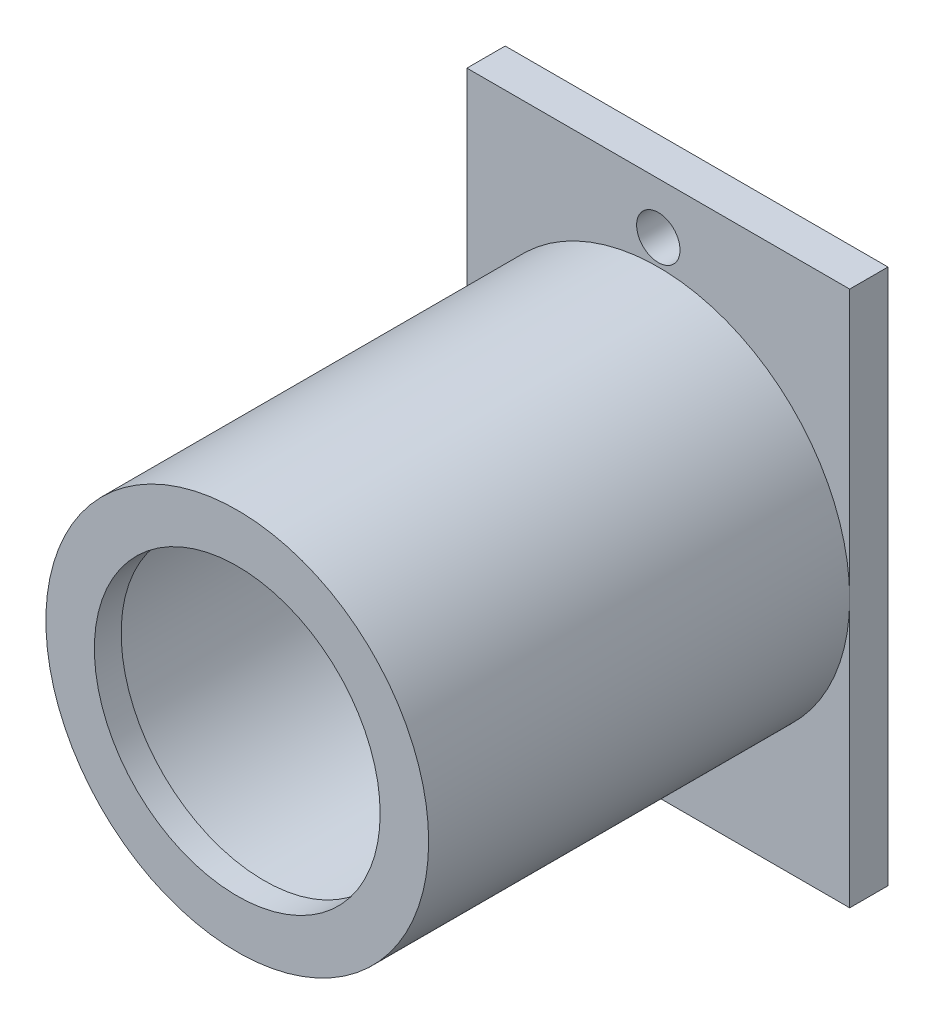
ISO-10303-21;
HEADER;
FILE_DESCRIPTION(('STEP AP214'),'2;1');
FILE_NAME('part.step','',(''),(''),'','','');
FILE_SCHEMA(('AUTOMOTIVE_DESIGN { 1 0 10303 214 1 1 1 1 }'));
ENDSEC;
DATA;
#1=APPLICATION_CONTEXT('core data for automotive mechanical design processes');
#2=APPLICATION_PROTOCOL_DEFINITION('international standard','automotive_design',2000,#1);
#3=PRODUCT_CONTEXT('',#1,'mechanical');
#4=PRODUCT('Part','Part','',(#3));
#5=PRODUCT_RELATED_PRODUCT_CATEGORY('part','',(#4));
#6=PRODUCT_DEFINITION_FORMATION('','',#4);
#7=PRODUCT_DEFINITION_CONTEXT('part definition',#1,'design');
#8=PRODUCT_DEFINITION('design','',#6,#7);
#9=PRODUCT_DEFINITION_SHAPE('','',#8);
#10=(LENGTH_UNIT() NAMED_UNIT(*) SI_UNIT(.MILLI.,.METRE.));
#11=(NAMED_UNIT(*) PLANE_ANGLE_UNIT() SI_UNIT($,.RADIAN.));
#12=(NAMED_UNIT(*) SI_UNIT($,.STERADIAN.) SOLID_ANGLE_UNIT());
#13=UNCERTAINTY_MEASURE_WITH_UNIT(LENGTH_MEASURE(1.E-05),#10,'distance_accuracy_value','');
#14=(GEOMETRIC_REPRESENTATION_CONTEXT(3) GLOBAL_UNCERTAINTY_ASSIGNED_CONTEXT((#13)) GLOBAL_UNIT_ASSIGNED_CONTEXT((#10,
#11,#12)) REPRESENTATION_CONTEXT('',''));
#15=CARTESIAN_POINT('',(0.,0.,0.));
#16=DIRECTION('',(0.,0.,1.));
#17=DIRECTION('',(1.,0.,0.));
#18=AXIS2_PLACEMENT_3D('',#15,#16,#17);
#19=CARTESIAN_POINT('',(-183.,76.,245.4));
#20=DIRECTION('',(0.,0.,1.));
#21=DIRECTION('',(1.,0.,0.));
#22=AXIS2_PLACEMENT_3D('',#19,#20,#21);
#23=CYLINDRICAL_SURFACE('',#22,13.);
#24=DIRECTION('',(0.,0.,1.));
#25=VECTOR('',#24,1.);
#26=CARTESIAN_POINT('',(-170.,76.,245.5));
#27=LINE('',#26,#25);
#28=CARTESIAN_POINT('',(-170.,76.,245.5));
#29=VERTEX_POINT('',#28);
#30=CARTESIAN_POINT('',(-170.,76.,279.4));
#31=VERTEX_POINT('',#30);
#32=EDGE_CURVE('E9',#29,#31,#27,.T.);
#33=ORIENTED_EDGE('',*,*,#32,.F.);
#34=CARTESIAN_POINT('',(-183.,76.,245.5));
#35=DIRECTION('',(0.,0.,1.));
#36=DIRECTION('',(1.,0.,0.));
#37=AXIS2_PLACEMENT_3D('',#34,#35,#36);
#38=CIRCLE('',#37,13.);
#39=EDGE_CURVE('E72',#29,#29,#38,.T.);
#40=ORIENTED_EDGE('',*,*,#39,.F.);
#41=ORIENTED_EDGE('',*,*,#32,.T.);
#42=CARTESIAN_POINT('',(-183.,76.,279.4));
#43=DIRECTION('',(0.,0.,1.));
#44=DIRECTION('',(1.,0.,0.));
#45=AXIS2_PLACEMENT_3D('',#42,#43,#44);
#46=CIRCLE('',#45,13.);
#47=EDGE_CURVE('E25',#31,#31,#46,.T.);
#48=ORIENTED_EDGE('',*,*,#47,.T.);
#49=EDGE_LOOP('',(#33,#40,#41,#48));
#50=FACE_BOUND('',#49,.T.);
#51=ADVANCED_FACE('F14',(#50),#23,.F.);
#52=CARTESIAN_POINT('',(-183.,76.,279.4));
#53=DIRECTION('',(0.,0.,1.));
#54=DIRECTION('',(1.,0.,0.));
#55=AXIS2_PLACEMENT_3D('',#52,#53,#54);
#56=PLANE('',#55);
#57=CARTESIAN_POINT('',(-183.,76.,279.4));
#58=DIRECTION('',(0.,0.,1.));
#59=DIRECTION('',(1.,0.,0.));
#60=AXIS2_PLACEMENT_3D('',#57,#58,#59);
#61=CIRCLE('',#60,11.2);
#62=CARTESIAN_POINT('',(-171.8,76.,279.4));
#63=VERTEX_POINT('',#62);
#64=EDGE_CURVE('E64',#63,#63,#61,.T.);
#65=ORIENTED_EDGE('',*,*,#64,.T.);
#66=EDGE_LOOP('',(#65));
#67=FACE_BOUND('',#66,.T.);
#68=ORIENTED_EDGE('',*,*,#47,.F.);
#69=EDGE_LOOP('',(#68));
#70=FACE_BOUND('',#69,.T.);
#71=ADVANCED_FACE('F16',(#67,#70),#56,.F.);
#72=CARTESIAN_POINT('',(-198.,55.,245.5));
#73=DIRECTION('',(0.,0.,1.));
#74=DIRECTION('',(1.,0.,0.));
#75=AXIS2_PLACEMENT_3D('',#72,#73,#74);
#76=PLANE('',#75);
#77=CARTESIAN_POINT('',(-183.,93.,245.5));
#78=DIRECTION('',(0.,0.,1.));
#79=DIRECTION('',(1.,0.,0.));
#80=AXIS2_PLACEMENT_3D('',#77,#78,#79);
#81=CIRCLE('',#80,1.7);
#82=CARTESIAN_POINT('',(-181.3,93.,245.5));
#83=VERTEX_POINT('',#82);
#84=EDGE_CURVE('E66',#83,#83,#81,.T.);
#85=ORIENTED_EDGE('',*,*,#84,.T.);
#86=EDGE_LOOP('',(#85));
#87=FACE_BOUND('',#86,.T.);
#88=ORIENTED_EDGE('',*,*,#39,.T.);
#89=EDGE_LOOP('',(#88));
#90=FACE_BOUND('',#89,.T.);
#91=CARTESIAN_POINT('',(-183.,59.,245.5));
#92=DIRECTION('',(0.,0.,1.));
#93=DIRECTION('',(1.,0.,0.));
#94=AXIS2_PLACEMENT_3D('',#91,#92,#93);
#95=CIRCLE('',#94,1.7);
#96=CARTESIAN_POINT('',(-181.3,59.,245.5));
#97=VERTEX_POINT('',#96);
#98=EDGE_CURVE('E120',#97,#97,#95,.T.);
#99=ORIENTED_EDGE('',*,*,#98,.T.);
#100=EDGE_LOOP('',(#99));
#101=FACE_BOUND('',#100,.T.);
#102=DIRECTION('',(0.,-1.,0.));
#103=VECTOR('',#102,1.);
#104=CARTESIAN_POINT('',(-198.,97.,245.5));
#105=LINE('',#104,#103);
#106=CARTESIAN_POINT('',(-198.,97.,245.5));
#107=VERTEX_POINT('',#106);
#108=CARTESIAN_POINT('',(-198.,55.,245.5));
#109=VERTEX_POINT('',#108);
#110=EDGE_CURVE('E106',#107,#109,#105,.T.);
#111=ORIENTED_EDGE('',*,*,#110,.F.);
#112=DIRECTION('',(1.,0.,0.));
#113=VECTOR('',#112,1.);
#114=CARTESIAN_POINT('',(-198.,97.,245.5));
#115=LINE('',#114,#113);
#116=CARTESIAN_POINT('',(-168.,97.,245.5));
#117=VERTEX_POINT('',#116);
#118=EDGE_CURVE('E116',#107,#117,#115,.T.);
#119=ORIENTED_EDGE('',*,*,#118,.T.);
#120=DIRECTION('',(0.,1.,0.));
#121=VECTOR('',#120,1.);
#122=CARTESIAN_POINT('',(-168.,55.,245.5));
#123=LINE('',#122,#121);
#124=CARTESIAN_POINT('',(-168.,55.,245.5));
#125=VERTEX_POINT('',#124);
#126=EDGE_CURVE('E111',#125,#117,#123,.T.);
#127=ORIENTED_EDGE('',*,*,#126,.F.);
#128=DIRECTION('',(1.,0.,0.));
#129=VECTOR('',#128,1.);
#130=CARTESIAN_POINT('',(-198.,55.,245.5));
#131=LINE('',#130,#129);
#132=EDGE_CURVE('E110',#109,#125,#131,.T.);
#133=ORIENTED_EDGE('',*,*,#132,.F.);
#134=EDGE_LOOP('',(#111,#119,#127,#133));
#135=FACE_BOUND('',#134,.T.);
#136=ADVANCED_FACE('F191',(#87,#90,#101,#135),#76,.F.);
#137=CARTESIAN_POINT('',(-183.,76.,279.4));
#138=DIRECTION('',(0.,0.,1.));
#139=DIRECTION('',(1.,0.,0.));
#140=AXIS2_PLACEMENT_3D('',#137,#138,#139);
#141=CYLINDRICAL_SURFACE('',#140,11.2);
#142=DIRECTION('',(0.,0.,1.));
#143=VECTOR('',#142,1.);
#144=CARTESIAN_POINT('',(-171.8,76.,279.4));
#145=LINE('',#144,#143);
#146=CARTESIAN_POINT('',(-171.8,76.,281.5));
#147=VERTEX_POINT('',#146);
#148=EDGE_CURVE('E60',#63,#147,#145,.T.);
#149=ORIENTED_EDGE('',*,*,#148,.F.);
#150=ORIENTED_EDGE('',*,*,#64,.F.);
#151=ORIENTED_EDGE('',*,*,#148,.T.);
#152=CARTESIAN_POINT('',(-183.,76.,281.5));
#153=DIRECTION('',(0.,0.,1.));
#154=DIRECTION('',(1.,0.,0.));
#155=AXIS2_PLACEMENT_3D('',#152,#153,#154);
#156=CIRCLE('',#155,11.2);
#157=EDGE_CURVE('E18',#147,#147,#156,.T.);
#158=ORIENTED_EDGE('',*,*,#157,.T.);
#159=EDGE_LOOP('',(#149,#150,#151,#158));
#160=FACE_BOUND('',#159,.T.);
#161=ADVANCED_FACE('F61',(#160),#141,.F.);
#162=CARTESIAN_POINT('',(-183.,93.,245.4));
#163=DIRECTION('',(0.,0.,1.));
#164=DIRECTION('',(1.,0.,0.));
#165=AXIS2_PLACEMENT_3D('',#162,#163,#164);
#166=CYLINDRICAL_SURFACE('',#165,1.7);
#167=DIRECTION('',(0.,0.,1.));
#168=VECTOR('',#167,1.);
#169=CARTESIAN_POINT('',(-181.3,93.,245.4));
#170=LINE('',#169,#168);
#171=CARTESIAN_POINT('',(-181.3,93.,248.5));
#172=VERTEX_POINT('',#171);
#173=EDGE_CURVE('E76',#83,#172,#170,.T.);
#174=ORIENTED_EDGE('',*,*,#173,.F.);
#175=ORIENTED_EDGE('',*,*,#84,.F.);
#176=ORIENTED_EDGE('',*,*,#173,.T.);
#177=CARTESIAN_POINT('',(-183.,93.,248.5));
#178=DIRECTION('',(0.,0.,1.));
#179=DIRECTION('',(1.,0.,0.));
#180=AXIS2_PLACEMENT_3D('',#177,#178,#179);
#181=CIRCLE('',#180,1.7);
#182=EDGE_CURVE('E144',#172,#172,#181,.T.);
#183=ORIENTED_EDGE('',*,*,#182,.T.);
#184=EDGE_LOOP('',(#174,#175,#176,#183));
#185=FACE_BOUND('',#184,.T.);
#186=ADVANCED_FACE('F284',(#185),#166,.F.);
#187=CARTESIAN_POINT('',(-198.,97.,245.5));
#188=DIRECTION('',(0.,1.,0.));
#189=DIRECTION('',(1.,0.,0.));
#190=AXIS2_PLACEMENT_3D('',#187,#188,#189);
#191=PLANE('',#190);
#192=ORIENTED_EDGE('',*,*,#118,.F.);
#193=DIRECTION('',(0.,0.,1.));
#194=VECTOR('',#193,1.);
#195=CARTESIAN_POINT('',(-198.,97.,245.5));
#196=LINE('',#195,#194);
#197=CARTESIAN_POINT('',(-198.,97.,248.5));
#198=VERTEX_POINT('',#197);
#199=EDGE_CURVE('E121',#107,#198,#196,.T.);
#200=ORIENTED_EDGE('',*,*,#199,.T.);
#201=DIRECTION('',(1.,0.,0.));
#202=VECTOR('',#201,1.);
#203=CARTESIAN_POINT('',(-198.,97.,248.5));
#204=LINE('',#203,#202);
#205=CARTESIAN_POINT('',(-168.,97.,248.5));
#206=VERTEX_POINT('',#205);
#207=EDGE_CURVE('E129',#198,#206,#204,.T.);
#208=ORIENTED_EDGE('',*,*,#207,.T.);
#209=DIRECTION('',(0.,0.,1.));
#210=VECTOR('',#209,1.);
#211=CARTESIAN_POINT('',(-168.,97.,245.5));
#212=LINE('',#211,#210);
#213=EDGE_CURVE('E115',#117,#206,#212,.T.);
#214=ORIENTED_EDGE('',*,*,#213,.F.);
#215=EDGE_LOOP('',(#192,#200,#208,#214));
#216=FACE_BOUND('',#215,.T.);
#217=ADVANCED_FACE('F280',(#216),#191,.T.);
#218=CARTESIAN_POINT('',(-183.,59.,245.4));
#219=DIRECTION('',(0.,0.,1.));
#220=DIRECTION('',(1.,0.,0.));
#221=AXIS2_PLACEMENT_3D('',#218,#219,#220);
#222=CYLINDRICAL_SURFACE('',#221,1.7);
#223=DIRECTION('',(0.,0.,1.));
#224=VECTOR('',#223,1.);
#225=CARTESIAN_POINT('',(-181.3,59.,245.4));
#226=LINE('',#225,#224);
#227=CARTESIAN_POINT('',(-181.3,59.,248.5));
#228=VERTEX_POINT('',#227);
#229=EDGE_CURVE('E132',#97,#228,#226,.T.);
#230=ORIENTED_EDGE('',*,*,#229,.F.);
#231=ORIENTED_EDGE('',*,*,#98,.F.);
#232=ORIENTED_EDGE('',*,*,#229,.T.);
#233=CARTESIAN_POINT('',(-183.,59.,248.5));
#234=DIRECTION('',(0.,0.,1.));
#235=DIRECTION('',(1.,0.,0.));
#236=AXIS2_PLACEMENT_3D('',#233,#234,#235);
#237=CIRCLE('',#236,1.7);
#238=EDGE_CURVE('E82',#228,#228,#237,.T.);
#239=ORIENTED_EDGE('',*,*,#238,.T.);
#240=EDGE_LOOP('',(#230,#231,#232,#239));
#241=FACE_BOUND('',#240,.T.);
#242=ADVANCED_FACE('F277',(#241),#222,.F.);
#243=CARTESIAN_POINT('',(-168.,55.,245.5));
#244=DIRECTION('',(1.,0.,0.));
#245=DIRECTION('',(0.,1.,0.));
#246=AXIS2_PLACEMENT_3D('',#243,#244,#245);
#247=PLANE('',#246);
#248=DIRECTION('',(0.,1.,0.));
#249=VECTOR('',#248,1.);
#250=CARTESIAN_POINT('',(-168.,55.,248.5));
#251=LINE('',#250,#249);
#252=CARTESIAN_POINT('',(-168.,55.,248.5));
#253=VERTEX_POINT('',#252);
#254=CARTESIAN_POINT('',(-168.,76.,248.5));
#255=VERTEX_POINT('',#254);
#256=EDGE_CURVE('E85',#253,#255,#251,.T.);
#257=ORIENTED_EDGE('',*,*,#256,.F.);
#258=DIRECTION('',(0.,0.,1.));
#259=VECTOR('',#258,1.);
#260=CARTESIAN_POINT('',(-168.,55.,245.5));
#261=LINE('',#260,#259);
#262=EDGE_CURVE('E105',#125,#253,#261,.T.);
#263=ORIENTED_EDGE('',*,*,#262,.F.);
#264=ORIENTED_EDGE('',*,*,#126,.T.);
#265=ORIENTED_EDGE('',*,*,#213,.T.);
#266=DIRECTION('',(0.,1.,0.));
#267=VECTOR('',#266,1.);
#268=CARTESIAN_POINT('',(-168.,55.,248.5));
#269=LINE('',#268,#267);
#270=EDGE_CURVE('E125',#255,#206,#269,.T.);
#271=ORIENTED_EDGE('',*,*,#270,.F.);
#272=EDGE_LOOP('',(#257,#263,#264,#265,#271));
#273=FACE_BOUND('',#272,.T.);
#274=ADVANCED_FACE('F244',(#273),#247,.T.);
#275=CARTESIAN_POINT('',(-198.,55.,245.5));
#276=DIRECTION('',(0.,1.,0.));
#277=DIRECTION('',(1.,0.,0.));
#278=AXIS2_PLACEMENT_3D('',#275,#276,#277);
#279=PLANE('',#278);
#280=ORIENTED_EDGE('',*,*,#262,.T.);
#281=DIRECTION('',(1.,0.,0.));
#282=VECTOR('',#281,1.);
#283=CARTESIAN_POINT('',(-198.,55.,248.5));
#284=LINE('',#283,#282);
#285=CARTESIAN_POINT('',(-198.,55.,248.5));
#286=VERTEX_POINT('',#285);
#287=EDGE_CURVE('E99',#286,#253,#284,.T.);
#288=ORIENTED_EDGE('',*,*,#287,.F.);
#289=DIRECTION('',(0.,0.,1.));
#290=VECTOR('',#289,1.);
#291=CARTESIAN_POINT('',(-198.,55.,245.5));
#292=LINE('',#291,#290);
#293=EDGE_CURVE('E101',#109,#286,#292,.T.);
#294=ORIENTED_EDGE('',*,*,#293,.F.);
#295=ORIENTED_EDGE('',*,*,#132,.T.);
#296=EDGE_LOOP('',(#280,#288,#294,#295));
#297=FACE_BOUND('',#296,.T.);
#298=ADVANCED_FACE('F197',(#297),#279,.F.);
#299=CARTESIAN_POINT('',(-198.,55.,245.5));
#300=DIRECTION('',(1.,0.,0.));
#301=DIRECTION('',(0.,1.,0.));
#302=AXIS2_PLACEMENT_3D('',#299,#300,#301);
#303=PLANE('',#302);
#304=DIRECTION('',(0.,1.,0.));
#305=VECTOR('',#304,1.);
#306=CARTESIAN_POINT('',(-198.,55.,248.5));
#307=LINE('',#306,#305);
#308=CARTESIAN_POINT('',(-198.,76.,248.5));
#309=VERTEX_POINT('',#308);
#310=EDGE_CURVE('E80',#309,#198,#307,.T.);
#311=ORIENTED_EDGE('',*,*,#310,.T.);
#312=ORIENTED_EDGE('',*,*,#199,.F.);
#313=ORIENTED_EDGE('',*,*,#110,.T.);
#314=ORIENTED_EDGE('',*,*,#293,.T.);
#315=DIRECTION('',(0.,1.,0.));
#316=VECTOR('',#315,1.);
#317=CARTESIAN_POINT('',(-198.,55.,248.5));
#318=LINE('',#317,#316);
#319=EDGE_CURVE('E95',#286,#309,#318,.T.);
#320=ORIENTED_EDGE('',*,*,#319,.T.);
#321=EDGE_LOOP('',(#311,#312,#313,#314,#320));
#322=FACE_BOUND('',#321,.T.);
#323=ADVANCED_FACE('F183',(#322),#303,.F.);
#324=CARTESIAN_POINT('',(-183.,76.,281.5));
#325=DIRECTION('',(0.,0.,1.));
#326=DIRECTION('',(1.,0.,0.));
#327=AXIS2_PLACEMENT_3D('',#324,#325,#326);
#328=PLANE('',#327);
#329=ORIENTED_EDGE('',*,*,#157,.F.);
#330=EDGE_LOOP('',(#329));
#331=FACE_BOUND('',#330,.T.);
#332=CARTESIAN_POINT('',(-183.,76.,281.5));
#333=DIRECTION('',(0.,0.,1.));
#334=DIRECTION('',(1.,0.,0.));
#335=AXIS2_PLACEMENT_3D('',#332,#333,#334);
#336=CIRCLE('',#335,15.);
#337=CARTESIAN_POINT('',(-168.,76.,281.5));
#338=VERTEX_POINT('',#337);
#339=EDGE_CURVE('E90',#338,#338,#336,.T.);
#340=ORIENTED_EDGE('',*,*,#339,.T.);
#341=EDGE_LOOP('',(#340));
#342=FACE_BOUND('',#341,.T.);
#343=ADVANCED_FACE('F249',(#331,#342),#328,.T.);
#344=CARTESIAN_POINT('',(-198.,55.,248.5));
#345=DIRECTION('',(0.,0.,1.));
#346=DIRECTION('',(1.,0.,0.));
#347=AXIS2_PLACEMENT_3D('',#344,#345,#346);
#348=PLANE('',#347);
#349=ORIENTED_EDGE('',*,*,#182,.F.);
#350=EDGE_LOOP('',(#349));
#351=FACE_BOUND('',#350,.T.);
#352=ORIENTED_EDGE('',*,*,#310,.F.);
#353=CARTESIAN_POINT('',(-183.,76.,248.5));
#354=DIRECTION('',(0.,0.,1.));
#355=DIRECTION('',(1.,0.,0.));
#356=AXIS2_PLACEMENT_3D('',#353,#354,#355);
#357=CIRCLE('',#356,15.);
#358=EDGE_CURVE('E94',#255,#309,#357,.T.);
#359=ORIENTED_EDGE('',*,*,#358,.F.);
#360=ORIENTED_EDGE('',*,*,#270,.T.);
#361=ORIENTED_EDGE('',*,*,#207,.F.);
#362=EDGE_LOOP('',(#352,#359,#360,#361));
#363=FACE_BOUND('',#362,.T.);
#364=ADVANCED_FACE('F245',(#351,#363),#348,.T.);
#365=CARTESIAN_POINT('',(-198.,55.,248.5));
#366=DIRECTION('',(0.,0.,1.));
#367=DIRECTION('',(1.,0.,0.));
#368=AXIS2_PLACEMENT_3D('',#365,#366,#367);
#369=PLANE('',#368);
#370=ORIENTED_EDGE('',*,*,#238,.F.);
#371=EDGE_LOOP('',(#370));
#372=FACE_BOUND('',#371,.T.);
#373=ORIENTED_EDGE('',*,*,#319,.F.);
#374=ORIENTED_EDGE('',*,*,#287,.T.);
#375=ORIENTED_EDGE('',*,*,#256,.T.);
#376=CARTESIAN_POINT('',(-183.,76.,248.5));
#377=DIRECTION('',(0.,0.,1.));
#378=DIRECTION('',(1.,0.,0.));
#379=AXIS2_PLACEMENT_3D('',#376,#377,#378);
#380=CIRCLE('',#379,15.);
#381=EDGE_CURVE('E100',#309,#255,#380,.T.);
#382=ORIENTED_EDGE('',*,*,#381,.F.);
#383=EDGE_LOOP('',(#373,#374,#375,#382));
#384=FACE_BOUND('',#383,.T.);
#385=ADVANCED_FACE('F204',(#372,#384),#369,.T.);
#386=CARTESIAN_POINT('',(-183.,76.,245.5));
#387=DIRECTION('',(0.,0.,1.));
#388=DIRECTION('',(1.,0.,0.));
#389=AXIS2_PLACEMENT_3D('',#386,#387,#388);
#390=CYLINDRICAL_SURFACE('',#389,15.);
#391=DIRECTION('',(0.,0.,1.));
#392=VECTOR('',#391,1.);
#393=CARTESIAN_POINT('',(-168.,76.,245.5));
#394=LINE('',#393,#392);
#395=EDGE_CURVE('E86',#255,#338,#394,.T.);
#396=ORIENTED_EDGE('',*,*,#395,.T.);
#397=ORIENTED_EDGE('',*,*,#339,.F.);
#398=ORIENTED_EDGE('',*,*,#395,.F.);
#399=ORIENTED_EDGE('',*,*,#358,.T.);
#400=ORIENTED_EDGE('',*,*,#381,.T.);
#401=EDGE_LOOP('',(#396,#397,#398,#399,#400));
#402=FACE_BOUND('',#401,.T.);
#403=ADVANCED_FACE('F247',(#402),#390,.T.);
#404=CLOSED_SHELL('',(#51,#71,#136,#161,#186,#217,#242,#274,#298,#323,#343,#364,#385,#403));
#405=MANIFOLD_SOLID_BREP('B1',#404);
#406=ADVANCED_BREP_SHAPE_REPRESENTATION('',(#18,#405),#14);
#407=SHAPE_DEFINITION_REPRESENTATION(#9,#406);
ENDSEC;
END-ISO-10303-21;
